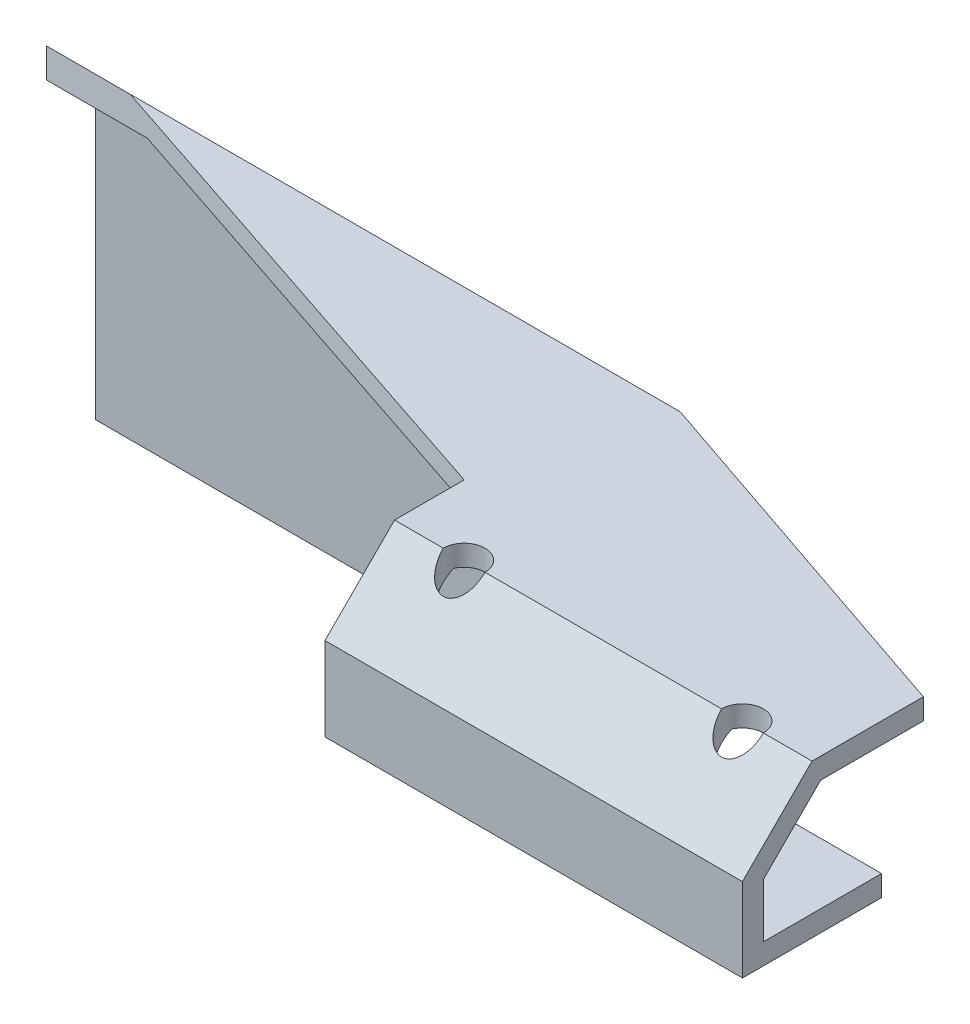
ISO-10303-21;
HEADER;
FILE_DESCRIPTION(('STEP AP214'),'2;1');
FILE_NAME('part.step','',(''),(''),'','','');
FILE_SCHEMA(('AUTOMOTIVE_DESIGN { 1 0 10303 214 1 1 1 1 }'));
ENDSEC;
DATA;
#1=APPLICATION_CONTEXT('core data for automotive mechanical design processes');
#2=APPLICATION_PROTOCOL_DEFINITION('international standard','automotive_design',2000,#1);
#3=PRODUCT_CONTEXT('',#1,'mechanical');
#4=PRODUCT('Part','Part','',(#3));
#5=PRODUCT_RELATED_PRODUCT_CATEGORY('part','',(#4));
#6=PRODUCT_DEFINITION_FORMATION('','',#4);
#7=PRODUCT_DEFINITION_CONTEXT('part definition',#1,'design');
#8=PRODUCT_DEFINITION('design','',#6,#7);
#9=PRODUCT_DEFINITION_SHAPE('','',#8);
#10=(LENGTH_UNIT() NAMED_UNIT(*) SI_UNIT(.MILLI.,.METRE.));
#11=(NAMED_UNIT(*) PLANE_ANGLE_UNIT() SI_UNIT($,.RADIAN.));
#12=(NAMED_UNIT(*) SI_UNIT($,.STERADIAN.) SOLID_ANGLE_UNIT());
#13=UNCERTAINTY_MEASURE_WITH_UNIT(LENGTH_MEASURE(1.E-05),#10,'distance_accuracy_value','');
#14=(GEOMETRIC_REPRESENTATION_CONTEXT(3) GLOBAL_UNCERTAINTY_ASSIGNED_CONTEXT((#13)) GLOBAL_UNIT_ASSIGNED_CONTEXT((#10,
#11,#12)) REPRESENTATION_CONTEXT('',''));
#15=CARTESIAN_POINT('',(0.,0.,0.));
#16=DIRECTION('',(0.,0.,1.));
#17=DIRECTION('',(1.,0.,0.));
#18=AXIS2_PLACEMENT_3D('',#15,#16,#17);
#19=CARTESIAN_POINT('',(-150.,3.,-20.));
#20=DIRECTION('',(0.,0.,-1.));
#21=DIRECTION('',(-1.,0.,0.));
#22=AXIS2_PLACEMENT_3D('',#19,#20,#21);
#23=PLANE('',#22);
#24=DIRECTION('',(1.,0.,0.));
#25=VECTOR('',#24,1.);
#26=CARTESIAN_POINT('',(-150.,3.,-20.));
#27=LINE('',#26,#25);
#28=CARTESIAN_POINT('',(-60.,3.,-20.));
#29=VERTEX_POINT('',#28);
#30=CARTESIAN_POINT('',(-45.,3.,-20.));
#31=VERTEX_POINT('',#30);
#32=EDGE_CURVE('E394',#29,#31,#27,.T.);
#33=ORIENTED_EDGE('',*,*,#32,.T.);
#34=DIRECTION('',(0.,-1.,0.));
#35=VECTOR('',#34,1.);
#36=CARTESIAN_POINT('',(-45.,0.,-20.));
#37=LINE('',#36,#35);
#38=CARTESIAN_POINT('',(-45.,0.,-20.));
#39=VERTEX_POINT('',#38);
#40=EDGE_CURVE('E402',#31,#39,#37,.T.);
#41=ORIENTED_EDGE('',*,*,#40,.T.);
#42=DIRECTION('',(1.,0.,0.));
#43=VECTOR('',#42,1.);
#44=CARTESIAN_POINT('',(-150.,0.,-20.));
#45=LINE('',#44,#43);
#46=CARTESIAN_POINT('',(-60.,0.,-20.));
#47=VERTEX_POINT('',#46);
#48=EDGE_CURVE('E355',#47,#39,#45,.T.);
#49=ORIENTED_EDGE('',*,*,#48,.F.);
#50=DIRECTION('',(0.,-1.,0.));
#51=VECTOR('',#50,1.);
#52=CARTESIAN_POINT('',(-60.,22.,-20.));
#53=LINE('',#52,#51);
#54=EDGE_CURVE('E261',#29,#47,#53,.T.);
#55=ORIENTED_EDGE('',*,*,#54,.F.);
#56=EDGE_LOOP('',(#33,#41,#49,#55));
#57=FACE_BOUND('',#56,.T.);
#58=ADVANCED_FACE('F33',(#57),#23,.T.);
#59=CARTESIAN_POINT('',(-150.,12.,0.));
#60=DIRECTION('',(0.,0.707106781186548,0.707106781186548));
#61=DIRECTION('',(0.,-0.707106781186548,0.707106781186548));
#62=AXIS2_PLACEMENT_3D('',#59,#60,#61);
#63=PLANE('',#62);
#64=DIRECTION('',(1.,0.,0.));
#65=VECTOR('',#64,1.);
#66=CARTESIAN_POINT('',(-150.,22.,-10.));
#67=LINE('',#66,#65);
#68=CARTESIAN_POINT('',(-7.,22.,-10.));
#69=VERTEX_POINT('',#68);
#70=CARTESIAN_POINT('',(0.,22.,-10.));
#71=VERTEX_POINT('',#70);
#72=EDGE_CURVE('E368',#69,#71,#67,.T.);
#73=ORIENTED_EDGE('',*,*,#72,.F.);
#74=CARTESIAN_POINT('',(-10.,22.,-9.99999999999999));
#75=DIRECTION('',(0.,0.707106781186548,0.707106781186548));
#76=DIRECTION('',(0.,-0.707106781186548,0.707106781186548));
#77=AXIS2_PLACEMENT_3D('',#74,#75,#76);
#78=ELLIPSE('',#77,4.24264068711928,3.);
#79=CARTESIAN_POINT('',(-13.,22.,-10.));
#80=VERTEX_POINT('',#79);
#81=EDGE_CURVE('E231',#69,#80,#78,.F.);
#82=ORIENTED_EDGE('',*,*,#81,.T.);
#83=CARTESIAN_POINT('',(-47.,22.,-10.));
#84=VERTEX_POINT('',#83);
#85=EDGE_CURVE('E367',#84,#80,#67,.T.);
#86=ORIENTED_EDGE('',*,*,#85,.F.);
#87=CARTESIAN_POINT('',(-50.,22.,-10.));
#88=DIRECTION('',(0.,0.707106781186548,0.707106781186548));
#89=DIRECTION('',(0.,-0.707106781186548,0.707106781186548));
#90=AXIS2_PLACEMENT_3D('',#87,#88,#89);
#91=ELLIPSE('',#90,4.24264068711929,3.);
#92=CARTESIAN_POINT('',(-53.,22.,-10.));
#93=VERTEX_POINT('',#92);
#94=EDGE_CURVE('E242',#84,#93,#91,.F.);
#95=ORIENTED_EDGE('',*,*,#94,.T.);
#96=CARTESIAN_POINT('',(-60.,22.,-10.));
#97=VERTEX_POINT('',#96);
#98=EDGE_CURVE('E364',#97,#93,#67,.T.);
#99=ORIENTED_EDGE('',*,*,#98,.F.);
#100=DIRECTION('',(0.,-0.707106781186548,0.707106781186548));
#101=VECTOR('',#100,1.);
#102=CARTESIAN_POINT('',(-60.,12.,0.));
#103=LINE('',#102,#101);
#104=CARTESIAN_POINT('',(-60.,12.,0.));
#105=VERTEX_POINT('',#104);
#106=EDGE_CURVE('E286',#97,#105,#103,.T.);
#107=ORIENTED_EDGE('',*,*,#106,.T.);
#108=DIRECTION('',(1.,0.,0.));
#109=VECTOR('',#108,1.);
#110=CARTESIAN_POINT('',(-150.,12.,0.));
#111=LINE('',#110,#109);
#112=CARTESIAN_POINT('',(0.,12.,0.));
#113=VERTEX_POINT('',#112);
#114=EDGE_CURVE('E362',#105,#113,#111,.T.);
#115=ORIENTED_EDGE('',*,*,#114,.T.);
#116=DIRECTION('',(0.,-0.707106781186548,0.707106781186548));
#117=VECTOR('',#116,1.);
#118=CARTESIAN_POINT('',(0.,12.,0.));
#119=LINE('',#118,#117);
#120=EDGE_CURVE('E347',#71,#113,#119,.T.);
#121=ORIENTED_EDGE('',*,*,#120,.F.);
#122=EDGE_LOOP('',(#73,#82,#86,#95,#99,#107,#115,#121));
#123=FACE_BOUND('',#122,.T.);
#124=ADVANCED_FACE('F426',(#123),#63,.T.);
#125=CARTESIAN_POINT('',(-150.,22.,-10.));
#126=DIRECTION('',(0.,1.,0.));
#127=DIRECTION('',(0.,0.,1.));
#128=AXIS2_PLACEMENT_3D('',#125,#126,#127);
#129=PLANE('',#128);
#130=ORIENTED_EDGE('',*,*,#85,.T.);
#131=CARTESIAN_POINT('',(-10.,22.,-9.99999999999999));
#132=DIRECTION('',(0.,1.,0.));
#133=DIRECTION('',(0.,0.,1.));
#134=AXIS2_PLACEMENT_3D('',#131,#132,#133);
#135=CIRCLE('',#134,3.);
#136=EDGE_CURVE('E219',#69,#80,#135,.T.);
#137=ORIENTED_EDGE('',*,*,#136,.F.);
#138=ORIENTED_EDGE('',*,*,#72,.T.);
#139=DIRECTION('',(0.,0.,1.));
#140=VECTOR('',#139,1.);
#141=CARTESIAN_POINT('',(0.,22.,-10.));
#142=LINE('',#141,#140);
#143=CARTESIAN_POINT('',(0.,22.,-26.));
#144=VERTEX_POINT('',#143);
#145=EDGE_CURVE('E344',#144,#71,#142,.T.);
#146=ORIENTED_EDGE('',*,*,#145,.F.);
#147=DIRECTION('',(0.946772744819713,0.,0.321902733238702));
#148=VECTOR('',#147,1.);
#149=CARTESIAN_POINT('',(-100.,22.,-60.));
#150=LINE('',#149,#148);
#151=CARTESIAN_POINT('',(-52.9411764705882,22.,-44.));
#152=VERTEX_POINT('',#151);
#153=EDGE_CURVE('E295',#152,#144,#150,.T.);
#154=ORIENTED_EDGE('',*,*,#153,.F.);
#155=DIRECTION('',(1.,0.,0.));
#156=VECTOR('',#155,1.);
#157=CARTESIAN_POINT('',(-150.,22.,-44.));
#158=LINE('',#157,#156);
#159=CARTESIAN_POINT('',(-132.,22.,-44.));
#160=VERTEX_POINT('',#159);
#161=EDGE_CURVE('E369',#160,#152,#158,.T.);
#162=ORIENTED_EDGE('',*,*,#161,.F.);
#163=DIRECTION('',(-0.948683298050514,0.,-0.316227766016838));
#164=VECTOR('',#163,1.);
#165=CARTESIAN_POINT('',(-60.,22.,-20.));
#166=LINE('',#165,#164);
#167=CARTESIAN_POINT('',(-60.,22.,-20.));
#168=VERTEX_POINT('',#167);
#169=EDGE_CURVE('E259',#168,#160,#166,.T.);
#170=ORIENTED_EDGE('',*,*,#169,.F.);
#171=DIRECTION('',(0.,0.,-1.));
#172=VECTOR('',#171,1.);
#173=CARTESIAN_POINT('',(-60.,22.,0.));
#174=LINE('',#173,#172);
#175=EDGE_CURVE('E255',#97,#168,#174,.T.);
#176=ORIENTED_EDGE('',*,*,#175,.F.);
#177=ORIENTED_EDGE('',*,*,#98,.T.);
#178=CARTESIAN_POINT('',(-50.,22.,-10.));
#179=DIRECTION('',(0.,1.,0.));
#180=DIRECTION('',(0.,0.,1.));
#181=AXIS2_PLACEMENT_3D('',#178,#179,#180);
#182=CIRCLE('',#181,3.);
#183=EDGE_CURVE('E234',#84,#93,#182,.T.);
#184=ORIENTED_EDGE('',*,*,#183,.F.);
#185=EDGE_LOOP('',(#130,#137,#138,#146,#154,#162,#170,#176,#177,#184));
#186=FACE_BOUND('',#185,.T.);
#187=ADVANCED_FACE('F433',(#186),#129,.T.);
#188=CARTESIAN_POINT('',(-150.,22.,-44.));
#189=DIRECTION('',(0.,0.707106781186548,-0.707106781186548));
#190=DIRECTION('',(0.,0.707106781186548,0.707106781186548));
#191=AXIS2_PLACEMENT_3D('',#188,#189,#190);
#192=PLANE('',#191);
#193=DIRECTION('',(0.,0.707106781186548,0.707106781186548));
#194=VECTOR('',#193,1.);
#195=CARTESIAN_POINT('',(-150.,22.,-44.));
#196=LINE('',#195,#194);
#197=CARTESIAN_POINT('',(-150.,6.,-60.));
#198=VERTEX_POINT('',#197);
#199=CARTESIAN_POINT('',(-150.,16.,-50.));
#200=VERTEX_POINT('',#199);
#201=EDGE_CURVE('E327',#198,#200,#196,.T.);
#202=ORIENTED_EDGE('',*,*,#201,.T.);
#203=DIRECTION('',(0.904534033733291,0.301511344577764,0.301511344577764));
#204=VECTOR('',#203,1.);
#205=CARTESIAN_POINT('',(-146.727272727273,17.0909090909091,-48.9090909090909));
#206=LINE('',#205,#204);
#207=EDGE_CURVE('E274',#200,#160,#206,.T.);
#208=ORIENTED_EDGE('',*,*,#207,.T.);
#209=ORIENTED_EDGE('',*,*,#161,.T.);
#210=DIRECTION('',(-0.901230117393125,-0.306418239913663,-0.306418239913663));
#211=VECTOR('',#210,1.);
#212=CARTESIAN_POINT('',(-131.7738791423,-4.80311890838207,-70.8031189083821));
#213=LINE('',#212,#211);
#214=CARTESIAN_POINT('',(-100.,6.,-60.));
#215=VERTEX_POINT('',#214);
#216=EDGE_CURVE('E311',#152,#215,#213,.T.);
#217=ORIENTED_EDGE('',*,*,#216,.T.);
#218=DIRECTION('',(1.,0.,0.));
#219=VECTOR('',#218,1.);
#220=CARTESIAN_POINT('',(-150.,6.,-60.));
#221=LINE('',#220,#219);
#222=EDGE_CURVE('E371',#198,#215,#221,.T.);
#223=ORIENTED_EDGE('',*,*,#222,.F.);
#224=EDGE_LOOP('',(#202,#208,#209,#217,#223));
#225=FACE_BOUND('',#224,.T.);
#226=ADVANCED_FACE('F440',(#225),#192,.T.);
#227=CARTESIAN_POINT('',(-150.,19.,-42.7573593128807));
#228=DIRECTION('',(0.,-0.707106781186547,0.707106781186548));
#229=DIRECTION('',(0.,-0.707106781186548,-0.707106781186547));
#230=AXIS2_PLACEMENT_3D('',#227,#228,#229);
#231=PLANE('',#230);
#232=DIRECTION('',(1.,0.,0.));
#233=VECTOR('',#232,1.);
#234=CARTESIAN_POINT('',(-150.,19.,-42.7573593128807));
#235=LINE('',#234,#233);
#236=CARTESIAN_POINT('',(-128.272077938642,19.,-42.7573593128807));
#237=VERTEX_POINT('',#236);
#238=CARTESIAN_POINT('',(-49.2863509202374,19.,-42.7573593128807));
#239=VERTEX_POINT('',#238);
#240=EDGE_CURVE('E383',#237,#239,#235,.T.);
#241=ORIENTED_EDGE('',*,*,#240,.F.);
#242=DIRECTION('',(-0.904534033733291,-0.301511344577764,-0.301511344577764));
#243=VECTOR('',#242,1.);
#244=CARTESIAN_POINT('',(-146.049468716117,13.0742030741751,-48.6831562387056));
#245=LINE('',#244,#243);
#246=CARTESIAN_POINT('',(-150.,11.7573593128807,-50.));
#247=VERTEX_POINT('',#246);
#248=EDGE_CURVE('E271',#237,#247,#245,.T.);
#249=ORIENTED_EDGE('',*,*,#248,.T.);
#250=DIRECTION('',(0.,-0.707106781186548,-0.707106781186547));
#251=VECTOR('',#250,1.);
#252=CARTESIAN_POINT('',(-150.,19.,-42.7573593128807));
#253=LINE('',#252,#251);
#254=CARTESIAN_POINT('',(-150.,4.75735931288072,-57.));
#255=VERTEX_POINT('',#254);
#256=EDGE_CURVE('E315',#247,#255,#253,.T.);
#257=ORIENTED_EDGE('',*,*,#256,.T.);
#258=DIRECTION('',(1.,0.,0.));
#259=VECTOR('',#258,1.);
#260=CARTESIAN_POINT('',(-150.,4.75735931288072,-57.));
#261=LINE('',#260,#259);
#262=CARTESIAN_POINT('',(-91.1764705882353,4.75735931288072,-57.));
#263=VERTEX_POINT('',#262);
#264=EDGE_CURVE('E380',#255,#263,#261,.T.);
#265=ORIENTED_EDGE('',*,*,#264,.T.);
#266=DIRECTION('',(0.901230117393125,0.306418239913663,0.306418239913663));
#267=VECTOR('',#266,1.);
#268=CARTESIAN_POINT('',(-131.087560374236,-8.8124112143594,-70.5697705272401));
#269=LINE('',#268,#267);
#270=EDGE_CURVE('E305',#263,#239,#269,.T.);
#271=ORIENTED_EDGE('',*,*,#270,.T.);
#272=EDGE_LOOP('',(#241,#249,#257,#265,#271));
#273=FACE_BOUND('',#272,.T.);
#274=ADVANCED_FACE('F458',(#273),#231,.T.);
#275=CARTESIAN_POINT('',(-150.,19.,-11.2426406871193));
#276=DIRECTION('',(0.,-1.,0.));
#277=DIRECTION('',(0.,0.,-1.));
#278=AXIS2_PLACEMENT_3D('',#275,#276,#277);
#279=PLANE('',#278);
#280=DIRECTION('',(1.,0.,0.));
#281=VECTOR('',#280,1.);
#282=CARTESIAN_POINT('',(-150.,19.,-11.2426406871193));
#283=LINE('',#282,#281);
#284=CARTESIAN_POINT('',(-7.26946083662663,19.,-11.2426406871193));
#285=VERTEX_POINT('',#284);
#286=CARTESIAN_POINT('',(0.,19.,-11.2426406871193));
#287=VERTEX_POINT('',#286);
#288=EDGE_CURVE('E389',#285,#287,#283,.T.);
#289=ORIENTED_EDGE('',*,*,#288,.F.);
#290=CARTESIAN_POINT('',(-10.,19.,-9.99999999999999));
#291=DIRECTION('',(0.,-1.,0.));
#292=DIRECTION('',(0.,0.,-1.));
#293=AXIS2_PLACEMENT_3D('',#290,#291,#292);
#294=CIRCLE('',#293,3.);
#295=CARTESIAN_POINT('',(-12.7305391633734,19.,-11.2426406871193));
#296=VERTEX_POINT('',#295);
#297=EDGE_CURVE('E228',#285,#296,#294,.F.);
#298=ORIENTED_EDGE('',*,*,#297,.T.);
#299=CARTESIAN_POINT('',(-47.2694608366266,19.,-11.2426406871193));
#300=VERTEX_POINT('',#299);
#301=EDGE_CURVE('E388',#300,#296,#283,.T.);
#302=ORIENTED_EDGE('',*,*,#301,.F.);
#303=CARTESIAN_POINT('',(-50.,19.,-10.));
#304=DIRECTION('',(0.,-1.,0.));
#305=DIRECTION('',(0.,0.,-1.));
#306=AXIS2_PLACEMENT_3D('',#303,#304,#305);
#307=CIRCLE('',#306,3.);
#308=CARTESIAN_POINT('',(-52.7305391633734,19.,-11.2426406871193));
#309=VERTEX_POINT('',#308);
#310=EDGE_CURVE('E239',#300,#309,#307,.F.);
#311=ORIENTED_EDGE('',*,*,#310,.T.);
#312=CARTESIAN_POINT('',(-60.,19.,-11.2426406871193));
#313=VERTEX_POINT('',#312);
#314=EDGE_CURVE('E385',#313,#309,#283,.T.);
#315=ORIENTED_EDGE('',*,*,#314,.F.);
#316=DIRECTION('',(0.,0.,-1.));
#317=VECTOR('',#316,1.);
#318=CARTESIAN_POINT('',(-60.,19.,-11.2426406871193));
#319=LINE('',#318,#317);
#320=CARTESIAN_POINT('',(-60.,19.,-20.));
#321=VERTEX_POINT('',#320);
#322=EDGE_CURVE('E283',#313,#321,#319,.T.);
#323=ORIENTED_EDGE('',*,*,#322,.T.);
#324=DIRECTION('',(-0.948683298050514,0.,-0.316227766016838));
#325=VECTOR('',#324,1.);
#326=CARTESIAN_POINT('',(-138.372792206136,19.,-46.1242640687119));
#327=LINE('',#326,#325);
#328=EDGE_CURVE('E268',#321,#237,#327,.T.);
#329=ORIENTED_EDGE('',*,*,#328,.T.);
#330=ORIENTED_EDGE('',*,*,#240,.T.);
#331=DIRECTION('',(0.946772744819713,0.,0.321902733238702));
#332=VECTOR('',#331,1.);
#333=CARTESIAN_POINT('',(-129.959212830424,19.,-70.186132362344));
#334=LINE('',#333,#332);
#335=CARTESIAN_POINT('',(0.,19.,-26.));
#336=VERTEX_POINT('',#335);
#337=EDGE_CURVE('E302',#239,#336,#334,.T.);
#338=ORIENTED_EDGE('',*,*,#337,.T.);
#339=DIRECTION('',(0.,0.,-1.));
#340=VECTOR('',#339,1.);
#341=CARTESIAN_POINT('',(0.,19.,-11.2426406871193));
#342=LINE('',#341,#340);
#343=EDGE_CURVE('E341',#287,#336,#342,.T.);
#344=ORIENTED_EDGE('',*,*,#343,.F.);
#345=EDGE_LOOP('',(#289,#298,#302,#311,#315,#323,#329,#330,#338,#344));
#346=FACE_BOUND('',#345,.T.);
#347=ADVANCED_FACE('F461',(#346),#279,.T.);
#348=CARTESIAN_POINT('',(-15.,0.,-20.));
#349=VERTEX_POINT('',#348);
#350=CARTESIAN_POINT('',(0.,0.,-20.));
#351=VERTEX_POINT('',#350);
#352=EDGE_CURVE('E359',#349,#351,#45,.T.);
#353=ORIENTED_EDGE('',*,*,#352,.F.);
#354=DIRECTION('',(0.,-1.,0.));
#355=VECTOR('',#354,1.);
#356=CARTESIAN_POINT('',(-15.,3.,-20.));
#357=LINE('',#356,#355);
#358=CARTESIAN_POINT('',(-15.,3.,-20.));
#359=VERTEX_POINT('',#358);
#360=EDGE_CURVE('E11',#349,#359,#357,.F.);
#361=ORIENTED_EDGE('',*,*,#360,.T.);
#362=CARTESIAN_POINT('',(0.,3.,-20.));
#363=VERTEX_POINT('',#362);
#364=EDGE_CURVE('E205',#359,#363,#27,.T.);
#365=ORIENTED_EDGE('',*,*,#364,.T.);
#366=DIRECTION('',(0.,1.,0.));
#367=VECTOR('',#366,1.);
#368=CARTESIAN_POINT('',(0.,3.,-20.));
#369=LINE('',#368,#367);
#370=EDGE_CURVE('E314',#351,#363,#369,.T.);
#371=ORIENTED_EDGE('',*,*,#370,.F.);
#372=EDGE_LOOP('',(#353,#361,#365,#371));
#373=FACE_BOUND('',#372,.T.);
#374=ADVANCED_FACE('F477',(#373),#23,.T.);
#375=CARTESIAN_POINT('',(-150.,0.,-20.));
#376=DIRECTION('',(0.,-1.,0.));
#377=DIRECTION('',(0.,0.,-1.));
#378=AXIS2_PLACEMENT_3D('',#375,#376,#377);
#379=PLANE('',#378);
#380=ORIENTED_EDGE('',*,*,#48,.T.);
#381=CARTESIAN_POINT('',(-45.,0.,-10.));
#382=DIRECTION('',(0.,-1.,0.));
#383=DIRECTION('',(0.,0.,-1.));
#384=AXIS2_PLACEMENT_3D('',#381,#382,#383);
#385=CIRCLE('',#384,10.);
#386=CARTESIAN_POINT('',(-35.,0.,-10.));
#387=VERTEX_POINT('',#386);
#388=EDGE_CURVE('E208',#39,#387,#385,.T.);
#389=ORIENTED_EDGE('',*,*,#388,.T.);
#390=CARTESIAN_POINT('',(-30.,0.,-10.));
#391=DIRECTION('',(0.,-1.,0.));
#392=DIRECTION('',(0.,0.,-1.));
#393=AXIS2_PLACEMENT_3D('',#390,#391,#392);
#394=CIRCLE('',#393,5.);
#395=CARTESIAN_POINT('',(-25.,0.,-10.));
#396=VERTEX_POINT('',#395);
#397=EDGE_CURVE('E217',#396,#387,#394,.T.);
#398=ORIENTED_EDGE('',*,*,#397,.F.);
#399=CARTESIAN_POINT('',(-15.,0.,-10.));
#400=DIRECTION('',(0.,-1.,0.));
#401=DIRECTION('',(0.,0.,-1.));
#402=AXIS2_PLACEMENT_3D('',#399,#400,#401);
#403=CIRCLE('',#402,10.);
#404=EDGE_CURVE('E54',#396,#349,#403,.T.);
#405=ORIENTED_EDGE('',*,*,#404,.T.);
#406=ORIENTED_EDGE('',*,*,#352,.T.);
#407=DIRECTION('',(0.,0.,-1.));
#408=VECTOR('',#407,1.);
#409=CARTESIAN_POINT('',(0.,0.,-20.));
#410=LINE('',#409,#408);
#411=CARTESIAN_POINT('',(0.,0.,0.));
#412=VERTEX_POINT('',#411);
#413=EDGE_CURVE('E318',#412,#351,#410,.T.);
#414=ORIENTED_EDGE('',*,*,#413,.F.);
#415=DIRECTION('',(1.,0.,0.));
#416=VECTOR('',#415,1.);
#417=CARTESIAN_POINT('',(-150.,0.,0.));
#418=LINE('',#417,#416);
#419=CARTESIAN_POINT('',(-60.,0.,0.));
#420=VERTEX_POINT('',#419);
#421=EDGE_CURVE('E360',#420,#412,#418,.T.);
#422=ORIENTED_EDGE('',*,*,#421,.F.);
#423=DIRECTION('',(0.,0.,-1.));
#424=VECTOR('',#423,1.);
#425=CARTESIAN_POINT('',(-60.,0.,-20.));
#426=LINE('',#425,#424);
#427=EDGE_CURVE('E289',#420,#47,#426,.T.);
#428=ORIENTED_EDGE('',*,*,#427,.T.);
#429=EDGE_LOOP('',(#380,#389,#398,#405,#406,#414,#422,#428));
#430=FACE_BOUND('',#429,.T.);
#431=CARTESIAN_POINT('',(-10.,0.,-9.99999999999999));
#432=DIRECTION('',(0.,-1.,0.));
#433=DIRECTION('',(0.,0.,-1.));
#434=AXIS2_PLACEMENT_3D('',#431,#432,#433);
#435=CIRCLE('',#434,1.6);
#436=CARTESIAN_POINT('',(-10.,0.,-11.6));
#437=VERTEX_POINT('',#436);
#438=EDGE_CURVE('E246',#437,#437,#435,.T.);
#439=ORIENTED_EDGE('',*,*,#438,.F.);
#440=EDGE_LOOP('',(#439));
#441=FACE_BOUND('',#440,.T.);
#442=CARTESIAN_POINT('',(-50.,0.,-10.));
#443=DIRECTION('',(0.,-1.,0.));
#444=DIRECTION('',(0.,0.,-1.));
#445=AXIS2_PLACEMENT_3D('',#442,#443,#444);
#446=CIRCLE('',#445,1.6);
#447=CARTESIAN_POINT('',(-50.,0.,-11.6));
#448=VERTEX_POINT('',#447);
#449=EDGE_CURVE('E252',#448,#448,#446,.T.);
#450=ORIENTED_EDGE('',*,*,#449,.F.);
#451=EDGE_LOOP('',(#450));
#452=FACE_BOUND('',#451,.T.);
#453=ADVANCED_FACE('F413',(#430,#441,#452),#379,.T.);
#454=CARTESIAN_POINT('',(-150.,0.,0.));
#455=DIRECTION('',(0.,0.,1.));
#456=DIRECTION('',(1.,0.,0.));
#457=AXIS2_PLACEMENT_3D('',#454,#455,#456);
#458=PLANE('',#457);
#459=ORIENTED_EDGE('',*,*,#114,.F.);
#460=DIRECTION('',(0.,-1.,0.));
#461=VECTOR('',#460,1.);
#462=CARTESIAN_POINT('',(-60.,22.,0.));
#463=LINE('',#462,#461);
#464=EDGE_CURVE('E265',#105,#420,#463,.T.);
#465=ORIENTED_EDGE('',*,*,#464,.T.);
#466=ORIENTED_EDGE('',*,*,#421,.T.);
#467=DIRECTION('',(0.,-1.,0.));
#468=VECTOR('',#467,1.);
#469=CARTESIAN_POINT('',(0.,0.,0.));
#470=LINE('',#469,#468);
#471=EDGE_CURVE('E350',#113,#412,#470,.T.);
#472=ORIENTED_EDGE('',*,*,#471,.F.);
#473=EDGE_LOOP('',(#459,#465,#466,#472));
#474=FACE_BOUND('',#473,.T.);
#475=ADVANCED_FACE('F421',(#474),#458,.T.);
#476=CARTESIAN_POINT('',(-150.,10.7573593128807,-3.));
#477=DIRECTION('',(0.,-0.707106781186547,-0.707106781186548));
#478=DIRECTION('',(0.,0.707106781186548,-0.707106781186547));
#479=AXIS2_PLACEMENT_3D('',#476,#477,#478);
#480=PLANE('',#479);
#481=ORIENTED_EDGE('',*,*,#301,.T.);
#482=CARTESIAN_POINT('',(-10.,17.7573593128807,-9.99999999999999));
#483=DIRECTION('',(0.,-0.707106781186547,-0.707106781186548));
#484=DIRECTION('',(0.,-0.707106781186548,0.707106781186547));
#485=AXIS2_PLACEMENT_3D('',#482,#483,#484);
#486=ELLIPSE('',#485,4.24264068711929,3.);
#487=EDGE_CURVE('E221',#296,#285,#486,.F.);
#488=ORIENTED_EDGE('',*,*,#487,.T.);
#489=ORIENTED_EDGE('',*,*,#288,.T.);
#490=DIRECTION('',(0.,0.707106781186548,-0.707106781186547));
#491=VECTOR('',#490,1.);
#492=CARTESIAN_POINT('',(0.,10.7573593128807,-3.));
#493=LINE('',#492,#491);
#494=CARTESIAN_POINT('',(0.,10.7573593128807,-3.));
#495=VERTEX_POINT('',#494);
#496=EDGE_CURVE('E338',#495,#287,#493,.T.);
#497=ORIENTED_EDGE('',*,*,#496,.F.);
#498=DIRECTION('',(1.,0.,0.));
#499=VECTOR('',#498,1.);
#500=CARTESIAN_POINT('',(-150.,10.7573593128807,-3.));
#501=LINE('',#500,#499);
#502=CARTESIAN_POINT('',(-60.,10.7573593128807,-3.));
#503=VERTEX_POINT('',#502);
#504=EDGE_CURVE('E390',#503,#495,#501,.T.);
#505=ORIENTED_EDGE('',*,*,#504,.F.);
#506=DIRECTION('',(0.,0.707106781186548,-0.707106781186547));
#507=VECTOR('',#506,1.);
#508=CARTESIAN_POINT('',(-60.,10.7573593128807,-3.));
#509=LINE('',#508,#507);
#510=EDGE_CURVE('E280',#503,#313,#509,.T.);
#511=ORIENTED_EDGE('',*,*,#510,.T.);
#512=ORIENTED_EDGE('',*,*,#314,.T.);
#513=CARTESIAN_POINT('',(-50.,17.7573593128807,-10.));
#514=DIRECTION('',(0.,-0.707106781186547,-0.707106781186548));
#515=DIRECTION('',(0.,-0.707106781186548,0.707106781186547));
#516=AXIS2_PLACEMENT_3D('',#513,#514,#515);
#517=ELLIPSE('',#516,4.24264068711929,3.);
#518=EDGE_CURVE('E236',#309,#300,#517,.F.);
#519=ORIENTED_EDGE('',*,*,#518,.T.);
#520=EDGE_LOOP('',(#481,#488,#489,#497,#505,#511,#512,#519));
#521=FACE_BOUND('',#520,.T.);
#522=ADVANCED_FACE('F467',(#521),#480,.T.);
#523=CARTESIAN_POINT('',(-150.,3.,-3.));
#524=DIRECTION('',(0.,0.,-1.));
#525=DIRECTION('',(0.,1.,0.));
#526=AXIS2_PLACEMENT_3D('',#523,#524,#525);
#527=PLANE('',#526);
#528=DIRECTION('',(1.,0.,0.));
#529=VECTOR('',#528,1.);
#530=CARTESIAN_POINT('',(-150.,3.,-3.));
#531=LINE('',#530,#529);
#532=CARTESIAN_POINT('',(-60.,3.,-3.));
#533=VERTEX_POINT('',#532);
#534=CARTESIAN_POINT('',(0.,3.,-3.));
#535=VERTEX_POINT('',#534);
#536=EDGE_CURVE('E392',#533,#535,#531,.T.);
#537=ORIENTED_EDGE('',*,*,#536,.F.);
#538=DIRECTION('',(0.,1.,0.));
#539=VECTOR('',#538,1.);
#540=CARTESIAN_POINT('',(-60.,3.,-3.));
#541=LINE('',#540,#539);
#542=EDGE_CURVE('E277',#533,#503,#541,.T.);
#543=ORIENTED_EDGE('',*,*,#542,.T.);
#544=ORIENTED_EDGE('',*,*,#504,.T.);
#545=DIRECTION('',(0.,1.,0.));
#546=VECTOR('',#545,1.);
#547=CARTESIAN_POINT('',(0.,3.,-3.));
#548=LINE('',#547,#546);
#549=EDGE_CURVE('E335',#535,#495,#548,.T.);
#550=ORIENTED_EDGE('',*,*,#549,.F.);
#551=EDGE_LOOP('',(#537,#543,#544,#550));
#552=FACE_BOUND('',#551,.T.);
#553=ADVANCED_FACE('F472',(#552),#527,.T.);
#554=CARTESIAN_POINT('',(-150.,3.,-20.));
#555=DIRECTION('',(0.,1.,0.));
#556=DIRECTION('',(0.,0.,1.));
#557=AXIS2_PLACEMENT_3D('',#554,#555,#556);
#558=PLANE('',#557);
#559=CARTESIAN_POINT('',(-30.,3.,-10.));
#560=DIRECTION('',(0.,1.,0.));
#561=DIRECTION('',(0.,0.,1.));
#562=AXIS2_PLACEMENT_3D('',#559,#560,#561);
#563=CIRCLE('',#562,5.);
#564=CARTESIAN_POINT('',(-25.,3.,-10.));
#565=VERTEX_POINT('',#564);
#566=CARTESIAN_POINT('',(-35.,3.,-10.));
#567=VERTEX_POINT('',#566);
#568=EDGE_CURVE('E202',#565,#567,#563,.F.);
#569=ORIENTED_EDGE('',*,*,#568,.T.);
#570=CARTESIAN_POINT('',(-45.,3.,-10.));
#571=DIRECTION('',(0.,1.,0.));
#572=DIRECTION('',(0.,0.,1.));
#573=AXIS2_PLACEMENT_3D('',#570,#571,#572);
#574=CIRCLE('',#573,10.);
#575=EDGE_CURVE('E41',#567,#31,#574,.T.);
#576=ORIENTED_EDGE('',*,*,#575,.T.);
#577=ORIENTED_EDGE('',*,*,#32,.F.);
#578=DIRECTION('',(0.,0.,1.));
#579=VECTOR('',#578,1.);
#580=CARTESIAN_POINT('',(-60.,3.,-20.));
#581=LINE('',#580,#579);
#582=EDGE_CURVE('E399',#29,#533,#581,.T.);
#583=ORIENTED_EDGE('',*,*,#582,.T.);
#584=ORIENTED_EDGE('',*,*,#536,.T.);
#585=DIRECTION('',(0.,0.,1.));
#586=VECTOR('',#585,1.);
#587=CARTESIAN_POINT('',(0.,3.,-20.));
#588=LINE('',#587,#586);
#589=EDGE_CURVE('E332',#363,#535,#588,.T.);
#590=ORIENTED_EDGE('',*,*,#589,.F.);
#591=ORIENTED_EDGE('',*,*,#364,.F.);
#592=CARTESIAN_POINT('',(-15.,3.,-10.));
#593=DIRECTION('',(0.,1.,0.));
#594=DIRECTION('',(0.,0.,1.));
#595=AXIS2_PLACEMENT_3D('',#592,#593,#594);
#596=CIRCLE('',#595,10.);
#597=EDGE_CURVE('E198',#359,#565,#596,.T.);
#598=ORIENTED_EDGE('',*,*,#597,.T.);
#599=EDGE_LOOP('',(#569,#576,#577,#583,#584,#590,#591,#598));
#600=FACE_BOUND('',#599,.T.);
#601=CARTESIAN_POINT('',(-50.,3.,-10.));
#602=DIRECTION('',(0.,1.,0.));
#603=DIRECTION('',(0.,0.,1.));
#604=AXIS2_PLACEMENT_3D('',#601,#602,#603);
#605=CIRCLE('',#604,1.6);
#606=CARTESIAN_POINT('',(-50.,3.,-8.4));
#607=VERTEX_POINT('',#606);
#608=EDGE_CURVE('E249',#607,#607,#605,.F.);
#609=ORIENTED_EDGE('',*,*,#608,.T.);
#610=EDGE_LOOP('',(#609));
#611=FACE_BOUND('',#610,.T.);
#612=CARTESIAN_POINT('',(-10.,3.,-9.99999999999999));
#613=DIRECTION('',(0.,1.,0.));
#614=DIRECTION('',(0.,0.,1.));
#615=AXIS2_PLACEMENT_3D('',#612,#613,#614);
#616=CIRCLE('',#615,1.6);
#617=CARTESIAN_POINT('',(-10.,3.,-8.39999999999999));
#618=VERTEX_POINT('',#617);
#619=EDGE_CURVE('E245',#618,#618,#616,.F.);
#620=ORIENTED_EDGE('',*,*,#619,.T.);
#621=EDGE_LOOP('',(#620));
#622=FACE_BOUND('',#621,.T.);
#623=ADVANCED_FACE('F200',(#600,#611,#622),#558,.T.);
#624=CARTESIAN_POINT('',(-150.,0.,0.));
#625=DIRECTION('',(-1.,0.,0.));
#626=DIRECTION('',(0.,0.,1.));
#627=AXIS2_PLACEMENT_3D('',#624,#625,#626);
#628=PLANE('',#627);
#629=ORIENTED_EDGE('',*,*,#256,.F.);
#630=DIRECTION('',(0.,1.,0.));
#631=VECTOR('',#630,1.);
#632=CARTESIAN_POINT('',(-150.,0.,-50.));
#633=LINE('',#632,#631);
#634=EDGE_CURVE('E358',#247,#200,#633,.T.);
#635=ORIENTED_EDGE('',*,*,#634,.T.);
#636=ORIENTED_EDGE('',*,*,#201,.F.);
#637=DIRECTION('',(0.,1.,0.));
#638=VECTOR('',#637,1.);
#639=CARTESIAN_POINT('',(-150.,6.,-60.));
#640=LINE('',#639,#638);
#641=CARTESIAN_POINT('',(-150.,-34.,-60.));
#642=VERTEX_POINT('',#641);
#643=EDGE_CURVE('E324',#642,#198,#640,.T.);
#644=ORIENTED_EDGE('',*,*,#643,.F.);
#645=DIRECTION('',(0.,0.,-1.));
#646=VECTOR('',#645,1.);
#647=CARTESIAN_POINT('',(-150.,-34.,-57.));
#648=LINE('',#647,#646);
#649=CARTESIAN_POINT('',(-150.,-34.,-57.));
#650=VERTEX_POINT('',#649);
#651=EDGE_CURVE('E321',#650,#642,#648,.T.);
#652=ORIENTED_EDGE('',*,*,#651,.F.);
#653=DIRECTION('',(0.,-1.,0.));
#654=VECTOR('',#653,1.);
#655=CARTESIAN_POINT('',(-150.,4.75735931288072,-57.));
#656=LINE('',#655,#654);
#657=EDGE_CURVE('E317',#255,#650,#656,.T.);
#658=ORIENTED_EDGE('',*,*,#657,.F.);
#659=EDGE_LOOP('',(#629,#635,#636,#644,#652,#658));
#660=FACE_BOUND('',#659,.T.);
#661=ADVANCED_FACE('F446',(#660),#628,.T.);
#662=CARTESIAN_POINT('',(-150.,6.,-60.));
#663=DIRECTION('',(0.,0.,-1.));
#664=DIRECTION('',(0.,1.,0.));
#665=AXIS2_PLACEMENT_3D('',#662,#663,#664);
#666=PLANE('',#665);
#667=ORIENTED_EDGE('',*,*,#222,.T.);
#668=DIRECTION('',(0.,-1.,0.));
#669=VECTOR('',#668,1.);
#670=CARTESIAN_POINT('',(-100.,22.,-60.));
#671=LINE('',#670,#669);
#672=CARTESIAN_POINT('',(-100.,-34.,-60.));
#673=VERTEX_POINT('',#672);
#674=EDGE_CURVE('E299',#215,#673,#671,.T.);
#675=ORIENTED_EDGE('',*,*,#674,.T.);
#676=DIRECTION('',(1.,0.,0.));
#677=VECTOR('',#676,1.);
#678=CARTESIAN_POINT('',(-150.,-34.,-60.));
#679=LINE('',#678,#677);
#680=EDGE_CURVE('E374',#642,#673,#679,.T.);
#681=ORIENTED_EDGE('',*,*,#680,.F.);
#682=ORIENTED_EDGE('',*,*,#643,.T.);
#683=EDGE_LOOP('',(#667,#675,#681,#682));
#684=FACE_BOUND('',#683,.T.);
#685=ADVANCED_FACE('F449',(#684),#666,.T.);
#686=CARTESIAN_POINT('',(-150.,-34.,-57.));
#687=DIRECTION('',(0.,-1.,0.));
#688=DIRECTION('',(0.,0.,-1.));
#689=AXIS2_PLACEMENT_3D('',#686,#687,#688);
#690=PLANE('',#689);
#691=ORIENTED_EDGE('',*,*,#680,.T.);
#692=DIRECTION('',(0.946772744819713,0.,0.321902733238702));
#693=VECTOR('',#692,1.);
#694=CARTESIAN_POINT('',(-100.,-34.,-60.));
#695=LINE('',#694,#693);
#696=CARTESIAN_POINT('',(-91.1764705882353,-34.,-57.));
#697=VERTEX_POINT('',#696);
#698=EDGE_CURVE('E292',#673,#697,#695,.T.);
#699=ORIENTED_EDGE('',*,*,#698,.T.);
#700=DIRECTION('',(1.,0.,0.));
#701=VECTOR('',#700,1.);
#702=CARTESIAN_POINT('',(-150.,-34.,-57.));
#703=LINE('',#702,#701);
#704=EDGE_CURVE('E377',#650,#697,#703,.T.);
#705=ORIENTED_EDGE('',*,*,#704,.F.);
#706=ORIENTED_EDGE('',*,*,#651,.T.);
#707=EDGE_LOOP('',(#691,#699,#705,#706));
#708=FACE_BOUND('',#707,.T.);
#709=ADVANCED_FACE('F451',(#708),#690,.T.);
#710=CARTESIAN_POINT('',(-150.,4.75735931288072,-57.));
#711=DIRECTION('',(0.,0.,1.));
#712=DIRECTION('',(0.,-1.,0.));
#713=AXIS2_PLACEMENT_3D('',#710,#711,#712);
#714=PLANE('',#713);
#715=ORIENTED_EDGE('',*,*,#704,.T.);
#716=DIRECTION('',(0.,1.,0.));
#717=VECTOR('',#716,1.);
#718=CARTESIAN_POINT('',(-91.1764705882353,4.75735931288069,-57.));
#719=LINE('',#718,#717);
#720=EDGE_CURVE('E308',#697,#263,#719,.T.);
#721=ORIENTED_EDGE('',*,*,#720,.T.);
#722=ORIENTED_EDGE('',*,*,#264,.F.);
#723=ORIENTED_EDGE('',*,*,#657,.T.);
#724=EDGE_LOOP('',(#715,#721,#722,#723));
#725=FACE_BOUND('',#724,.T.);
#726=ADVANCED_FACE('F455',(#725),#714,.T.);
#727=CARTESIAN_POINT('',(0.,0.,0.));
#728=DIRECTION('',(-1.,0.,0.));
#729=DIRECTION('',(0.,0.,1.));
#730=AXIS2_PLACEMENT_3D('',#727,#728,#729);
#731=PLANE('',#730);
#732=DIRECTION('',(0.,-1.,0.));
#733=VECTOR('',#732,1.);
#734=CARTESIAN_POINT('',(0.,22.,-26.));
#735=LINE('',#734,#733);
#736=EDGE_CURVE('E297',#144,#336,#735,.T.);
#737=ORIENTED_EDGE('',*,*,#736,.F.);
#738=ORIENTED_EDGE('',*,*,#145,.T.);
#739=ORIENTED_EDGE('',*,*,#120,.T.);
#740=ORIENTED_EDGE('',*,*,#471,.T.);
#741=ORIENTED_EDGE('',*,*,#413,.T.);
#742=ORIENTED_EDGE('',*,*,#370,.T.);
#743=ORIENTED_EDGE('',*,*,#589,.T.);
#744=ORIENTED_EDGE('',*,*,#549,.T.);
#745=ORIENTED_EDGE('',*,*,#496,.T.);
#746=ORIENTED_EDGE('',*,*,#343,.T.);
#747=EDGE_LOOP('',(#737,#738,#739,#740,#741,#742,#743,#744,#745,#746));
#748=FACE_BOUND('',#747,.T.);
#749=ADVANCED_FACE('F476',(#748),#731,.F.);
#750=CARTESIAN_POINT('',(-100.,22.,-60.));
#751=DIRECTION('',(0.321902733238702,0.,-0.946772744819713));
#752=DIRECTION('',(-0.946772744819713,0.,-0.321902733238702));
#753=AXIS2_PLACEMENT_3D('',#750,#751,#752);
#754=PLANE('',#753);
#755=ORIENTED_EDGE('',*,*,#153,.T.);
#756=ORIENTED_EDGE('',*,*,#736,.T.);
#757=ORIENTED_EDGE('',*,*,#337,.F.);
#758=ORIENTED_EDGE('',*,*,#270,.F.);
#759=ORIENTED_EDGE('',*,*,#720,.F.);
#760=ORIENTED_EDGE('',*,*,#698,.F.);
#761=ORIENTED_EDGE('',*,*,#674,.F.);
#762=ORIENTED_EDGE('',*,*,#216,.F.);
#763=EDGE_LOOP('',(#755,#756,#757,#758,#759,#760,#761,#762));
#764=FACE_BOUND('',#763,.T.);
#765=ADVANCED_FACE('F520',(#764),#754,.T.);
#766=CARTESIAN_POINT('',(-60.,22.,0.));
#767=DIRECTION('',(-1.,0.,0.));
#768=DIRECTION('',(0.,0.,1.));
#769=AXIS2_PLACEMENT_3D('',#766,#767,#768);
#770=PLANE('',#769);
#771=ORIENTED_EDGE('',*,*,#464,.F.);
#772=ORIENTED_EDGE('',*,*,#106,.F.);
#773=ORIENTED_EDGE('',*,*,#175,.T.);
#774=EDGE_CURVE('E262',#168,#321,#53,.T.);
#775=ORIENTED_EDGE('',*,*,#774,.T.);
#776=ORIENTED_EDGE('',*,*,#322,.F.);
#777=ORIENTED_EDGE('',*,*,#510,.F.);
#778=ORIENTED_EDGE('',*,*,#542,.F.);
#779=ORIENTED_EDGE('',*,*,#582,.F.);
#780=ORIENTED_EDGE('',*,*,#54,.T.);
#781=ORIENTED_EDGE('',*,*,#427,.F.);
#782=EDGE_LOOP('',(#771,#772,#773,#775,#776,#777,#778,#779,#780,#781));
#783=FACE_BOUND('',#782,.T.);
#784=ADVANCED_FACE('F418',(#783),#770,.T.);
#785=CARTESIAN_POINT('',(-60.,22.,-20.));
#786=DIRECTION('',(-0.316227766016838,0.,0.948683298050514));
#787=DIRECTION('',(0.948683298050514,0.,0.316227766016838));
#788=AXIS2_PLACEMENT_3D('',#785,#786,#787);
#789=PLANE('',#788);
#790=ORIENTED_EDGE('',*,*,#634,.F.);
#791=ORIENTED_EDGE('',*,*,#248,.F.);
#792=ORIENTED_EDGE('',*,*,#328,.F.);
#793=ORIENTED_EDGE('',*,*,#774,.F.);
#794=ORIENTED_EDGE('',*,*,#169,.T.);
#795=ORIENTED_EDGE('',*,*,#207,.F.);
#796=EDGE_LOOP('',(#790,#791,#792,#793,#794,#795));
#797=FACE_BOUND('',#796,.T.);
#798=ADVANCED_FACE('F438',(#797),#789,.T.);
#799=CARTESIAN_POINT('',(-50.,22.001,-10.));
#800=DIRECTION('',(0.,-1.,0.));
#801=DIRECTION('',(0.,0.,-1.));
#802=AXIS2_PLACEMENT_3D('',#799,#800,#801);
#803=CYLINDRICAL_SURFACE('',#802,1.6);
#804=ORIENTED_EDGE('',*,*,#608,.F.);
#805=EDGE_LOOP('',(#804));
#806=FACE_BOUND('',#805,.T.);
#807=ORIENTED_EDGE('',*,*,#449,.T.);
#808=EDGE_LOOP('',(#807));
#809=FACE_BOUND('',#808,.T.);
#810=ADVANCED_FACE('F551',(#806,#809),#803,.F.);
#811=CARTESIAN_POINT('',(-10.,22.001,-9.99999999999999));
#812=DIRECTION('',(0.,-1.,0.));
#813=DIRECTION('',(0.,0.,-1.));
#814=AXIS2_PLACEMENT_3D('',#811,#812,#813);
#815=CYLINDRICAL_SURFACE('',#814,1.6);
#816=ORIENTED_EDGE('',*,*,#619,.F.);
#817=EDGE_LOOP('',(#816));
#818=FACE_BOUND('',#817,.T.);
#819=ORIENTED_EDGE('',*,*,#438,.T.);
#820=EDGE_LOOP('',(#819));
#821=FACE_BOUND('',#820,.T.);
#822=ADVANCED_FACE('F545',(#818,#821),#815,.F.);
#823=CARTESIAN_POINT('',(-50.,22.,-10.));
#824=DIRECTION('',(0.,-1.,0.));
#825=DIRECTION('',(0.,0.,-1.));
#826=AXIS2_PLACEMENT_3D('',#823,#824,#825);
#827=CYLINDRICAL_SURFACE('',#826,3.);
#828=ORIENTED_EDGE('',*,*,#518,.F.);
#829=ORIENTED_EDGE('',*,*,#310,.F.);
#830=EDGE_LOOP('',(#828,#829));
#831=FACE_BOUND('',#830,.T.);
#832=ORIENTED_EDGE('',*,*,#183,.T.);
#833=ORIENTED_EDGE('',*,*,#94,.F.);
#834=EDGE_LOOP('',(#832,#833));
#835=FACE_BOUND('',#834,.T.);
#836=ADVANCED_FACE('F537',(#831,#835),#827,.F.);
#837=CARTESIAN_POINT('',(-10.,22.,-9.99999999999999));
#838=DIRECTION('',(0.,-1.,0.));
#839=DIRECTION('',(0.,0.,-1.));
#840=AXIS2_PLACEMENT_3D('',#837,#838,#839);
#841=CYLINDRICAL_SURFACE('',#840,3.);
#842=ORIENTED_EDGE('',*,*,#487,.F.);
#843=ORIENTED_EDGE('',*,*,#297,.F.);
#844=EDGE_LOOP('',(#842,#843));
#845=FACE_BOUND('',#844,.T.);
#846=ORIENTED_EDGE('',*,*,#136,.T.);
#847=ORIENTED_EDGE('',*,*,#81,.F.);
#848=EDGE_LOOP('',(#846,#847));
#849=FACE_BOUND('',#848,.T.);
#850=ADVANCED_FACE('F535',(#845,#849),#841,.F.);
#851=CARTESIAN_POINT('',(-30.,22.001,-10.));
#852=DIRECTION('',(0.,-1.,0.));
#853=DIRECTION('',(0.,0.,-1.));
#854=AXIS2_PLACEMENT_3D('',#851,#852,#853);
#855=CYLINDRICAL_SURFACE('',#854,5.);
#856=DIRECTION('',(0.,-1.,0.));
#857=VECTOR('',#856,1.);
#858=CARTESIAN_POINT('',(-25.,22.001,-10.));
#859=LINE('',#858,#857);
#860=EDGE_CURVE('E214',#565,#396,#859,.T.);
#861=ORIENTED_EDGE('',*,*,#860,.T.);
#862=ORIENTED_EDGE('',*,*,#397,.T.);
#863=DIRECTION('',(0.,-1.,0.));
#864=VECTOR('',#863,1.);
#865=CARTESIAN_POINT('',(-35.,22.001,-10.));
#866=LINE('',#865,#864);
#867=EDGE_CURVE('E216',#567,#387,#866,.T.);
#868=ORIENTED_EDGE('',*,*,#867,.F.);
#869=ORIENTED_EDGE('',*,*,#568,.F.);
#870=EDGE_LOOP('',(#861,#862,#868,#869));
#871=FACE_BOUND('',#870,.T.);
#872=ADVANCED_FACE('F212',(#871),#855,.F.);
#873=CARTESIAN_POINT('',(-45.,3.,-10.));
#874=DIRECTION('',(0.,1.,0.));
#875=DIRECTION('',(0.,0.,1.));
#876=AXIS2_PLACEMENT_3D('',#873,#874,#875);
#877=CYLINDRICAL_SURFACE('',#876,10.);
#878=ORIENTED_EDGE('',*,*,#575,.F.);
#879=ORIENTED_EDGE('',*,*,#867,.T.);
#880=ORIENTED_EDGE('',*,*,#388,.F.);
#881=ORIENTED_EDGE('',*,*,#40,.F.);
#882=EDGE_LOOP('',(#878,#879,#880,#881));
#883=FACE_BOUND('',#882,.T.);
#884=ADVANCED_FACE('F412',(#883),#877,.T.);
#885=CARTESIAN_POINT('',(-15.,22.001,-10.));
#886=DIRECTION('',(0.,1.,0.));
#887=DIRECTION('',(0.,0.,1.));
#888=AXIS2_PLACEMENT_3D('',#885,#886,#887);
#889=CYLINDRICAL_SURFACE('',#888,10.);
#890=ORIENTED_EDGE('',*,*,#597,.F.);
#891=ORIENTED_EDGE('',*,*,#360,.F.);
#892=ORIENTED_EDGE('',*,*,#404,.F.);
#893=ORIENTED_EDGE('',*,*,#860,.F.);
#894=EDGE_LOOP('',(#890,#891,#892,#893));
#895=FACE_BOUND('',#894,.T.);
#896=ADVANCED_FACE('F35',(#895),#889,.T.);
#897=CLOSED_SHELL('',(#58,#124,#187,#226,#274,#347,#374,#453,#475,#522,#553,#623,#661,#685,#709,
#726,#749,#765,#784,#798,#810,#822,#836,#850,#872,#884,#896));
#898=MANIFOLD_SOLID_BREP('B2',#897);
#899=ADVANCED_BREP_SHAPE_REPRESENTATION('',(#18,#898),#14);
#900=SHAPE_DEFINITION_REPRESENTATION(#9,#899);
ENDSEC;
END-ISO-10303-21;
